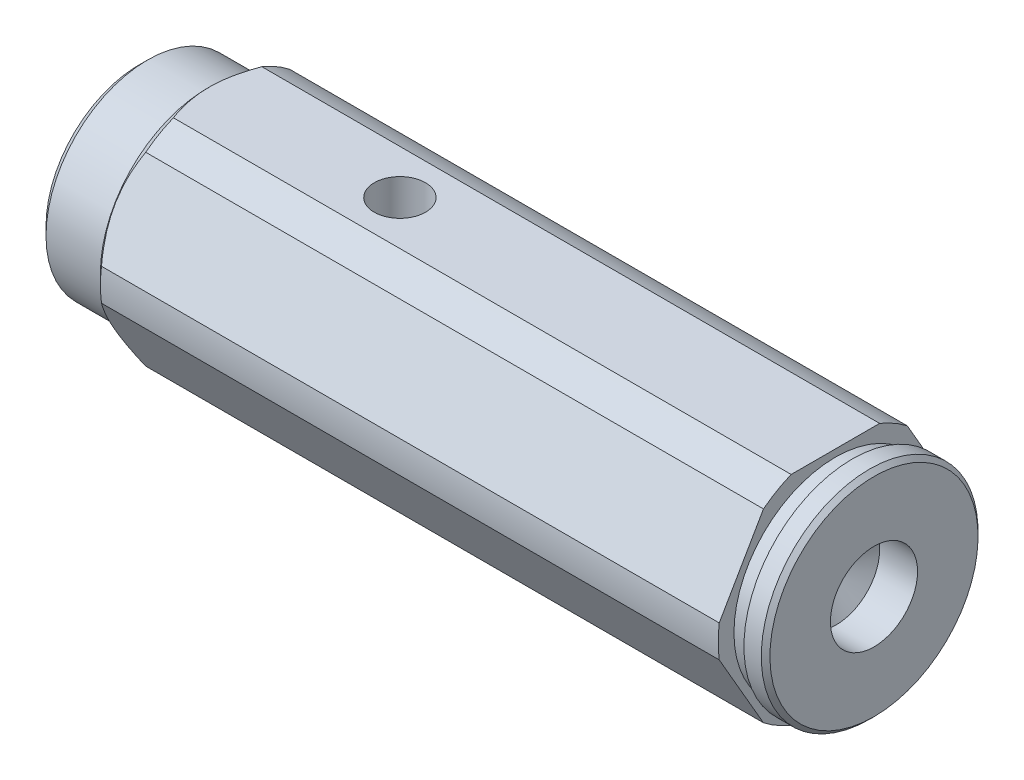
ISO-10303-21;
HEADER;
FILE_DESCRIPTION(('STEP AP214'),'2;1');
FILE_NAME('part.step','',(''),(''),'','','');
FILE_SCHEMA(('AUTOMOTIVE_DESIGN { 1 0 10303 214 1 1 1 1 }'));
ENDSEC;
DATA;
#1=APPLICATION_CONTEXT('core data for automotive mechanical design processes');
#2=APPLICATION_PROTOCOL_DEFINITION('international standard','automotive_design',2000,#1);
#3=PRODUCT_CONTEXT('',#1,'mechanical');
#4=PRODUCT('Part','Part','',(#3));
#5=PRODUCT_RELATED_PRODUCT_CATEGORY('part','',(#4));
#6=PRODUCT_DEFINITION_FORMATION('','',#4);
#7=PRODUCT_DEFINITION_CONTEXT('part definition',#1,'design');
#8=PRODUCT_DEFINITION('design','',#6,#7);
#9=PRODUCT_DEFINITION_SHAPE('','',#8);
#10=(LENGTH_UNIT() NAMED_UNIT(*) SI_UNIT(.MILLI.,.METRE.));
#11=(NAMED_UNIT(*) PLANE_ANGLE_UNIT() SI_UNIT($,.RADIAN.));
#12=(NAMED_UNIT(*) SI_UNIT($,.STERADIAN.) SOLID_ANGLE_UNIT());
#13=UNCERTAINTY_MEASURE_WITH_UNIT(LENGTH_MEASURE(1.E-05),#10,'distance_accuracy_value','');
#14=(GEOMETRIC_REPRESENTATION_CONTEXT(3) GLOBAL_UNCERTAINTY_ASSIGNED_CONTEXT((#13)) GLOBAL_UNIT_ASSIGNED_CONTEXT((#10,
#11,#12)) REPRESENTATION_CONTEXT('',''));
#15=CARTESIAN_POINT('',(0.,0.,0.));
#16=DIRECTION('',(0.,0.,1.));
#17=DIRECTION('',(1.,0.,0.));
#18=AXIS2_PLACEMENT_3D('',#15,#16,#17);
#19=CARTESIAN_POINT('',(9.84250000000097,-12.2936,0.));
#20=DIRECTION('',(-1.,0.,0.));
#21=DIRECTION('',(0.,-1.,0.));
#22=AXIS2_PLACEMENT_3D('',#19,#20,#21);
#23=PLANE('',#22);
#24=CARTESIAN_POINT('',(9.84250000000097,0.,0.));
#25=DIRECTION('',(1.,0.,0.));
#26=DIRECTION('',(0.,1.,0.));
#27=AXIS2_PLACEMENT_3D('',#24,#25,#26);
#28=CIRCLE('',#27,5.9436);
#29=CARTESIAN_POINT('',(9.84250000000097,5.9436,0.));
#30=VERTEX_POINT('',#29);
#31=EDGE_CURVE('E462',#30,#30,#28,.T.);
#32=ORIENTED_EDGE('',*,*,#31,.T.);
#33=EDGE_LOOP('',(#32));
#34=FACE_BOUND('',#33,.T.);
#35=CARTESIAN_POINT('',(9.84250000000096,0.,0.));
#36=DIRECTION('',(-1.,0.,0.));
#37=DIRECTION('',(0.,-1.,0.));
#38=AXIS2_PLACEMENT_3D('',#35,#36,#37);
#39=CIRCLE('',#38,6.35);
#40=CARTESIAN_POINT('',(9.84250000000097,-6.35,0.));
#41=VERTEX_POINT('',#40);
#42=EDGE_CURVE('E454',#41,#41,#39,.F.);
#43=ORIENTED_EDGE('',*,*,#42,.F.);
#44=EDGE_LOOP('',(#43));
#45=FACE_BOUND('',#44,.T.);
#46=ADVANCED_FACE('F40',(#34,#45),#23,.T.);
#47=CARTESIAN_POINT('',(27.94,0.,0.));
#48=DIRECTION('',(-1.,0.,0.));
#49=DIRECTION('',(0.,0.,1.));
#50=AXIS2_PLACEMENT_3D('',#47,#48,#49);
#51=CYLINDRICAL_SURFACE('',#50,6.87);
#52=DIRECTION('',(1.,0.,0.));
#53=VECTOR('',#52,1.);
#54=CARTESIAN_POINT('',(27.94,-6.3627,2.5909358753161));
#55=LINE('',#54,#53);
#56=CARTESIAN_POINT('',(-27.3399999999487,-6.3627,2.5909358753161));
#57=VERTEX_POINT('',#56);
#58=CARTESIAN_POINT('',(8.85190000000097,-6.3627,2.5909358753161));
#59=VERTEX_POINT('',#58);
#60=EDGE_CURVE('E102',#57,#59,#55,.T.);
#61=ORIENTED_EDGE('',*,*,#60,.T.);
#62=CARTESIAN_POINT('',(8.85190000000097,0.,0.));
#63=DIRECTION('',(1.,0.,0.));
#64=DIRECTION('',(0.,1.,0.));
#65=AXIS2_PLACEMENT_3D('',#62,#63,#64);
#66=CIRCLE('',#65,6.87);
#67=CARTESIAN_POINT('',(8.85190000000097,-5.42516628760019,4.21479189900122));
#68=VERTEX_POINT('',#67);
#69=EDGE_CURVE('E426',#59,#68,#66,.F.);
#70=ORIENTED_EDGE('',*,*,#69,.T.);
#71=DIRECTION('',(1.,0.,0.));
#72=VECTOR('',#71,1.);
#73=CARTESIAN_POINT('',(27.94,-5.42516628760019,4.21479189900122));
#74=LINE('',#73,#72);
#75=CARTESIAN_POINT('',(-27.3399999999487,-5.42516628752593,4.2147918990441));
#76=VERTEX_POINT('',#75);
#77=EDGE_CURVE('E209',#68,#76,#74,.F.);
#78=ORIENTED_EDGE('',*,*,#77,.T.);
#79=CARTESIAN_POINT('',(-27.339999999981,0.,0.));
#80=DIRECTION('',(1.,0.,0.));
#81=DIRECTION('',(0.,0.,1.));
#82=AXIS2_PLACEMENT_3D('',#79,#80,#81);
#83=CIRCLE('',#82,6.86999999993532);
#84=EDGE_CURVE('E212',#57,#76,#83,.F.);
#85=ORIENTED_EDGE('',*,*,#84,.F.);
#86=EDGE_LOOP('',(#61,#70,#78,#85));
#87=FACE_BOUND('',#86,.T.);
#88=ADVANCED_FACE('F281',(#87),#51,.T.);
#89=CARTESIAN_POINT('',(27.94,0.,7.34701311554568));
#90=DIRECTION('',(0.,0.5,-0.866025403784439));
#91=DIRECTION('',(0.,0.866025403784439,0.5));
#92=AXIS2_PLACEMENT_3D('',#89,#90,#91);
#93=PLANE('',#92);
#94=DIRECTION('',(0.,-0.866025403784439,-0.5));
#95=VECTOR('',#94,1.);
#96=CARTESIAN_POINT('',(8.85190000000097,0.,7.34701311554568));
#97=LINE('',#96,#95);
#98=CARTESIAN_POINT('',(8.85190000000097,-0.937533712399819,6.80572777431729));
#99=VERTEX_POINT('',#98);
#100=EDGE_CURVE('E429',#99,#68,#97,.T.);
#101=ORIENTED_EDGE('',*,*,#100,.F.);
#102=DIRECTION('',(1.,0.,0.));
#103=VECTOR('',#102,1.);
#104=CARTESIAN_POINT('',(27.94,-0.937533712399818,6.80572777431729));
#105=LINE('',#104,#103);
#106=CARTESIAN_POINT('',(-27.3399999999582,-0.937533712399819,6.80572777431729));
#107=VERTEX_POINT('',#106);
#108=EDGE_CURVE('E205',#107,#99,#105,.T.);
#109=ORIENTED_EDGE('',*,*,#108,.F.);
#110=CARTESIAN_POINT('',(-27.3399999999295,-5.42516628756962,4.21479189901865));
#111=CARTESIAN_POINT('',(-27.4177524265544,-5.24674178489839,4.31780533366605));
#112=CARTESIAN_POINT('',(-27.4885447931628,-5.06582668726134,4.42225671398733));
#113=CARTESIAN_POINT('',(-27.613400827378,-4.69923644543791,4.63390768878643));
#114=CARTESIAN_POINT('',(-27.6674204618428,-4.51355013472259,4.74111373026273));
#115=CARTESIAN_POINT('',(-27.753920348793,-4.14524333451015,4.95375576050974));
#116=CARTESIAN_POINT('',(-27.7870983610038,-3.96274870055006,5.05911908655226));
#117=CARTESIAN_POINT('',(-27.8327726491121,-3.59603778281758,5.27083973361989));
#118=CARTESIAN_POINT('',(-27.8452955763513,-3.41182402654936,5.37719559538977));
#119=CARTESIAN_POINT('',(-27.8489291778511,-3.03582263387905,5.59428010066365));
#120=CARTESIAN_POINT('',(-27.8391597405084,-2.84402793454131,5.70501282195544));
#121=CARTESIAN_POINT('',(-27.7970877773142,-2.46207754842718,5.92553198019551));
#122=CARTESIAN_POINT('',(-27.7647533343715,-2.27192456994404,6.03531685350996));
#123=CARTESIAN_POINT('',(-27.6781098340017,-1.8878776083856,6.25704647014719));
#124=CARTESIAN_POINT('',(-27.6230060406517,-1.69411957788003,6.36891272121723));
#125=CARTESIAN_POINT('',(-27.5265183598588,-1.40734551374411,6.53448180434271));
#126=CARTESIAN_POINT('',(-27.492099471478,-1.31250822958288,6.5892361358824));
#127=CARTESIAN_POINT('',(-27.4190813772406,-1.12408781290484,6.69802071417229));
#128=CARTESIAN_POINT('',(-27.3804838302452,-1.03050419916018,6.75205123875951));
#129=CARTESIAN_POINT('',(-27.3399999999273,-0.937533712424899,6.80572777430281));
#130=B_SPLINE_CURVE_WITH_KNOTS('',3,(#110,#111,#112,#113,#114,#115,#116,#117,#118,#119,#120,
#121,#122,#123,#124,#125,#126,#127,#128,#129),.UNSPECIFIED.,.F.,.F.,(4,2,2,2,2,2,2,2,2,4),(0.,
0.660858380522295,1.32343731080322,1.96245014707575,2.60063781557024,3.26445505033315,
3.92921313004727,4.61944983056105,4.96375213920367,5.30791826304414),.UNSPECIFIED.);
#131=EDGE_CURVE('E196',#76,#107,#130,.T.);
#132=ORIENTED_EDGE('',*,*,#131,.F.);
#133=ORIENTED_EDGE('',*,*,#77,.F.);
#134=EDGE_LOOP('',(#101,#109,#132,#133));
#135=FACE_BOUND('',#134,.T.);
#136=ADVANCED_FACE('F276',(#135),#93,.F.);
#137=CARTESIAN_POINT('',(27.94,-6.3627,3.67350655777285));
#138=DIRECTION('',(0.,1.,0.));
#139=DIRECTION('',(0.,0.,1.));
#140=AXIS2_PLACEMENT_3D('',#137,#138,#139);
#141=PLANE('',#140);
#142=CARTESIAN_POINT('',(-16.66238,-6.3627,0.));
#143=DIRECTION('',(0.,1.,0.));
#144=DIRECTION('',(0.,0.,1.));
#145=AXIS2_PLACEMENT_3D('',#142,#143,#144);
#146=CIRCLE('',#145,1.5);
#147=CARTESIAN_POINT('',(-16.66238,-6.3627,1.5));
#148=VERTEX_POINT('',#147);
#149=EDGE_CURVE('E302',#148,#148,#146,.T.);
#150=ORIENTED_EDGE('',*,*,#149,.T.);
#151=EDGE_LOOP('',(#150));
#152=FACE_BOUND('',#151,.T.);
#153=DIRECTION('',(0.,0.,-1.));
#154=VECTOR('',#153,1.);
#155=CARTESIAN_POINT('',(8.85190000000097,-6.3627,3.67350655777285));
#156=LINE('',#155,#154);
#157=CARTESIAN_POINT('',(8.85190000000097,-6.36270000000548,-2.59093587530264));
#158=VERTEX_POINT('',#157);
#159=EDGE_CURVE('E432',#59,#158,#156,.T.);
#160=ORIENTED_EDGE('',*,*,#159,.F.);
#161=ORIENTED_EDGE('',*,*,#60,.F.);
#162=CARTESIAN_POINT('',(-27.3399999999345,-6.36270000001469,-2.59093587528708));
#163=CARTESIAN_POINT('',(-27.4177524265554,-6.36270000000527,-2.38490900599071));
#164=CARTESIAN_POINT('',(-27.4885447931624,-6.36270000000141,-2.17600624534726));
#165=CARTESIAN_POINT('',(-27.6134008273768,-6.36269999999858,-1.75270429574781));
#166=CARTESIAN_POINT('',(-27.6674204618422,-6.36269999999963,-1.53829221279482));
#167=CARTESIAN_POINT('',(-27.753920348793,-6.36270000000036,-1.11300815229975));
#168=CARTESIAN_POINT('',(-27.7870983610039,-6.3627000000001,-0.902281500214052));
#169=CARTESIAN_POINT('',(-27.8327726491122,-6.3626999999999,-0.478840206077576));
#170=CARTESIAN_POINT('',(-27.8452955763514,-6.36269999999997,-0.266128482537216));
#171=CARTESIAN_POINT('',(-27.8489291778511,-6.36270000000003,0.168040528010437));
#172=CARTESIAN_POINT('',(-27.8391597405084,-6.36270000000001,0.389505970593345));
#173=CARTESIAN_POINT('',(-27.7970877773142,-6.36269999999999,0.830544287072172));
#174=CARTESIAN_POINT('',(-27.7647533343717,-6.3627,1.05011403370043));
#175=CARTESIAN_POINT('',(-27.6781098340022,-6.3627,1.49357326697346));
#176=CARTESIAN_POINT('',(-27.6230060406525,-6.3627,1.71730576911277));
#177=CARTESIAN_POINT('',(-27.5265183598601,-6.3627,2.04844393536258));
#178=CARTESIAN_POINT('',(-27.4920994714795,-6.3627,2.15795259844159));
#179=CARTESIAN_POINT('',(-27.4190813772425,-6.3627,2.37552175502061));
#180=CARTESIAN_POINT('',(-27.3804838302473,-6.3627,2.48358280419467));
#181=CARTESIAN_POINT('',(-27.3399999999296,-6.3627,2.59093587528091));
#182=B_SPLINE_CURVE_WITH_KNOTS('',3,(#162,#163,#164,#165,#166,#167,#168,#169,#170,#171,#172,
#173,#174,#175,#176,#177,#178,#179,#180,#181),.UNSPECIFIED.,.F.,.F.,(4,2,2,2,2,2,2,2,2,4),(0.,
0.660858380523664,1.32343731080623,1.96245014708063,2.60063781557688,3.26445505033778,
3.92921313004995,4.61944983056128,4.96375213920262,5.30791826304182),.UNSPECIFIED.);
#183=CARTESIAN_POINT('',(-27.3399999999641,-6.3627,-2.59093587530041));
#184=VERTEX_POINT('',#183);
#185=EDGE_CURVE('E215',#184,#57,#182,.T.);
#186=ORIENTED_EDGE('',*,*,#185,.F.);
#187=DIRECTION('',(-1.,0.,0.));
#188=VECTOR('',#187,1.);
#189=CARTESIAN_POINT('',(27.94,-6.3627,-2.5909358753161));
#190=LINE('',#189,#188);
#191=EDGE_CURVE('E195',#158,#184,#190,.T.);
#192=ORIENTED_EDGE('',*,*,#191,.F.);
#193=EDGE_LOOP('',(#160,#161,#186,#192));
#194=FACE_BOUND('',#193,.T.);
#195=ADVANCED_FACE('F280',(#152,#194),#141,.F.);
#196=CARTESIAN_POINT('',(27.94,0.,0.));
#197=DIRECTION('',(-1.,0.,0.));
#198=DIRECTION('',(0.,0.,1.));
#199=AXIS2_PLACEMENT_3D('',#196,#197,#198);
#200=CYLINDRICAL_SURFACE('',#199,6.87);
#201=ORIENTED_EDGE('',*,*,#108,.T.);
#202=CARTESIAN_POINT('',(8.85190000000097,0.,0.));
#203=DIRECTION('',(1.,0.,0.));
#204=DIRECTION('',(0.,1.,0.));
#205=AXIS2_PLACEMENT_3D('',#202,#203,#204);
#206=CIRCLE('',#205,6.87);
#207=CARTESIAN_POINT('',(8.85190000000096,0.937533712399824,6.80572777431729));
#208=VERTEX_POINT('',#207);
#209=EDGE_CURVE('E431',#99,#208,#206,.F.);
#210=ORIENTED_EDGE('',*,*,#209,.T.);
#211=DIRECTION('',(1.,0.,0.));
#212=VECTOR('',#211,1.);
#213=CARTESIAN_POINT('',(27.94,0.937533712399821,6.80572777431729));
#214=LINE('',#213,#212);
#215=CARTESIAN_POINT('',(-27.3399999999582,0.937533712399824,6.80572777431729));
#216=VERTEX_POINT('',#215);
#217=EDGE_CURVE('E190',#208,#216,#214,.F.);
#218=ORIENTED_EDGE('',*,*,#217,.T.);
#219=CARTESIAN_POINT('',(-27.34,0.,0.));
#220=DIRECTION('',(-1.,0.,0.));
#221=DIRECTION('',(0.,0.,1.));
#222=AXIS2_PLACEMENT_3D('',#219,#220,#221);
#223=CIRCLE('',#222,6.87);
#224=EDGE_CURVE('E197',#216,#107,#223,.F.);
#225=ORIENTED_EDGE('',*,*,#224,.T.);
#226=EDGE_LOOP('',(#201,#210,#218,#225));
#227=FACE_BOUND('',#226,.T.);
#228=ADVANCED_FACE('F312',(#227),#200,.T.);
#229=CARTESIAN_POINT('',(27.94,0.,0.));
#230=DIRECTION('',(-1.,0.,0.));
#231=DIRECTION('',(0.,0.,1.));
#232=AXIS2_PLACEMENT_3D('',#229,#230,#231);
#233=CYLINDRICAL_SURFACE('',#232,6.87);
#234=DIRECTION('',(1.,0.,0.));
#235=VECTOR('',#234,1.);
#236=CARTESIAN_POINT('',(27.94,-5.42516628760024,-4.21479189900117));
#237=LINE('',#236,#235);
#238=CARTESIAN_POINT('',(-27.3399999999582,-5.42516628760024,-4.21479189900117));
#239=VERTEX_POINT('',#238);
#240=CARTESIAN_POINT('',(8.85190000000097,-5.42516628760024,-4.21479189900117));
#241=VERTEX_POINT('',#240);
#242=EDGE_CURVE('E174',#239,#241,#237,.T.);
#243=ORIENTED_EDGE('',*,*,#242,.T.);
#244=CARTESIAN_POINT('',(8.85190000000097,0.,0.));
#245=DIRECTION('',(1.,0.,0.));
#246=DIRECTION('',(0.,1.,0.));
#247=AXIS2_PLACEMENT_3D('',#244,#245,#246);
#248=CIRCLE('',#247,6.87);
#249=EDGE_CURVE('E420',#241,#158,#248,.F.);
#250=ORIENTED_EDGE('',*,*,#249,.T.);
#251=ORIENTED_EDGE('',*,*,#191,.T.);
#252=CARTESIAN_POINT('',(-27.34,0.,0.));
#253=DIRECTION('',(-1.,0.,0.));
#254=DIRECTION('',(0.,0.,1.));
#255=AXIS2_PLACEMENT_3D('',#252,#253,#254);
#256=CIRCLE('',#255,6.87);
#257=EDGE_CURVE('E193',#184,#239,#256,.F.);
#258=ORIENTED_EDGE('',*,*,#257,.T.);
#259=EDGE_LOOP('',(#243,#250,#251,#258));
#260=FACE_BOUND('',#259,.T.);
#261=ADVANCED_FACE('F310',(#260),#233,.T.);
#262=CARTESIAN_POINT('',(27.94,6.3627,3.67350655777285));
#263=DIRECTION('',(0.,-0.5,-0.866025403784439));
#264=DIRECTION('',(0.,0.866025403784439,-0.5));
#265=AXIS2_PLACEMENT_3D('',#262,#263,#264);
#266=PLANE('',#265);
#267=DIRECTION('',(0.,-0.866025403784439,0.5));
#268=VECTOR('',#267,1.);
#269=CARTESIAN_POINT('',(8.85190000000096,6.3627,3.67350655777285));
#270=LINE('',#269,#268);
#271=CARTESIAN_POINT('',(8.85190000000097,5.42516628757105,4.21479189903873));
#272=VERTEX_POINT('',#271);
#273=EDGE_CURVE('E401',#272,#208,#270,.T.);
#274=ORIENTED_EDGE('',*,*,#273,.F.);
#275=DIRECTION('',(-1.,0.,0.));
#276=VECTOR('',#275,1.);
#277=CARTESIAN_POINT('',(27.94,5.42516628760019,4.21479189900123));
#278=LINE('',#277,#276);
#279=CARTESIAN_POINT('',(-27.339999999955,5.42516628758564,4.21479189900963));
#280=VERTEX_POINT('',#279);
#281=EDGE_CURVE('E187',#280,#272,#278,.F.);
#282=ORIENTED_EDGE('',*,*,#281,.F.);
#283=CARTESIAN_POINT('',(-27.3399999999345,0.937533712432305,6.80572777431551));
#284=CARTESIAN_POINT('',(-27.4177524265554,1.11595821510043,6.70271433965917));
#285=CARTESIAN_POINT('',(-27.4885447931624,1.29687331273642,6.5982629593341));
#286=CARTESIAN_POINT('',(-27.6134008273768,1.66346355455962,6.38661198453192));
#287=CARTESIAN_POINT('',(-27.6674204618422,1.84914986527576,6.27940594305633));
#288=CARTESIAN_POINT('',(-27.753920348793,2.21745666548945,6.06676391280943));
#289=CARTESIAN_POINT('',(-27.7870983610039,2.39995129944998,5.96140058676635));
#290=CARTESIAN_POINT('',(-27.8327726491122,2.76666221718343,5.74967993969795));
#291=CARTESIAN_POINT('',(-27.8452955763513,2.95087597345219,5.64332407792783));
#292=CARTESIAN_POINT('',(-27.8489291778511,3.32687736612252,5.426239572654));
#293=CARTESIAN_POINT('',(-27.8391597405083,3.51867206545977,5.31550685136248));
#294=CARTESIAN_POINT('',(-27.7970877773142,3.90062245157292,5.09498769312295));
#295=CARTESIAN_POINT('',(-27.7647533343716,4.09077543005559,4.98520281980877));
#296=CARTESIAN_POINT('',(-27.678109834002,4.47482239161299,4.76347320317216));
#297=CARTESIAN_POINT('',(-27.6230060406523,4.66858042211798,4.65160695210245));
#298=CARTESIAN_POINT('',(-27.5265183598598,4.95535448625305,4.48603786897746));
#299=CARTESIAN_POINT('',(-27.4920994714792,5.05019177041398,4.43128353743793));
#300=CARTESIAN_POINT('',(-27.4190813772421,5.23861218709145,4.32249895914838));
#301=CARTESIAN_POINT('',(-27.3804838302468,5.33219580083583,4.26846843456132));
#302=CARTESIAN_POINT('',(-27.3399999999292,5.42516628757083,4.21479189901818));
#303=B_SPLINE_CURVE_WITH_KNOTS('',3,(#283,#284,#285,#286,#287,#288,#289,#290,#291,#292,#293,
#294,#295,#296,#297,#298,#299,#300,#301,#302),.UNSPECIFIED.,.F.,.F.,(4,2,2,2,2,2,2,2,2,4),(0.,
0.660858380523661,1.32343731080623,1.96245014708062,2.60063781557687,3.26445505033807,
3.92921313005056,4.61944983056224,4.96375213920375,5.30791826304312),.UNSPECIFIED.);
#304=EDGE_CURVE('E186',#216,#280,#303,.T.);
#305=ORIENTED_EDGE('',*,*,#304,.F.);
#306=ORIENTED_EDGE('',*,*,#217,.F.);
#307=EDGE_LOOP('',(#274,#282,#305,#306));
#308=FACE_BOUND('',#307,.T.);
#309=ADVANCED_FACE('F400',(#308),#266,.F.);
#310=CARTESIAN_POINT('',(27.94,0.,0.));
#311=DIRECTION('',(-1.,0.,0.));
#312=DIRECTION('',(0.,0.,1.));
#313=AXIS2_PLACEMENT_3D('',#310,#311,#312);
#314=CYLINDRICAL_SURFACE('',#313,6.87);
#315=ORIENTED_EDGE('',*,*,#281,.T.);
#316=CARTESIAN_POINT('',(8.85190000000097,0.,0.));
#317=DIRECTION('',(1.,0.,0.));
#318=DIRECTION('',(0.,1.,0.));
#319=AXIS2_PLACEMENT_3D('',#316,#317,#318);
#320=CIRCLE('',#319,6.87);
#321=CARTESIAN_POINT('',(8.85190000000096,6.3627,2.5909358753161));
#322=VERTEX_POINT('',#321);
#323=EDGE_CURVE('E406',#272,#322,#320,.F.);
#324=ORIENTED_EDGE('',*,*,#323,.T.);
#325=DIRECTION('',(1.,0.,0.));
#326=VECTOR('',#325,1.);
#327=CARTESIAN_POINT('',(27.94,6.3627,2.5909358753161));
#328=LINE('',#327,#326);
#329=CARTESIAN_POINT('',(-27.3399999999487,6.3627,2.59093587523034));
#330=VERTEX_POINT('',#329);
#331=EDGE_CURVE('E180',#322,#330,#328,.F.);
#332=ORIENTED_EDGE('',*,*,#331,.T.);
#333=CARTESIAN_POINT('',(-27.339999999981,0.,0.));
#334=DIRECTION('',(1.,0.,0.));
#335=DIRECTION('',(0.,0.,1.));
#336=AXIS2_PLACEMENT_3D('',#333,#334,#335);
#337=CIRCLE('',#336,6.86999999993532);
#338=EDGE_CURVE('E183',#280,#330,#337,.F.);
#339=ORIENTED_EDGE('',*,*,#338,.F.);
#340=EDGE_LOOP('',(#315,#324,#332,#339));
#341=FACE_BOUND('',#340,.T.);
#342=ADVANCED_FACE('F404',(#341),#314,.T.);
#343=CARTESIAN_POINT('',(27.94,6.3627,-3.67350655777281));
#344=DIRECTION('',(0.,-1.,0.));
#345=DIRECTION('',(0.,0.,-1.));
#346=AXIS2_PLACEMENT_3D('',#343,#344,#345);
#347=PLANE('',#346);
#348=CARTESIAN_POINT('',(-16.66238,6.3627,0.));
#349=DIRECTION('',(0.,1.,0.));
#350=DIRECTION('',(0.,0.,1.));
#351=AXIS2_PLACEMENT_3D('',#348,#349,#350);
#352=CIRCLE('',#351,1.5);
#353=CARTESIAN_POINT('',(-16.66238,6.3627,1.5));
#354=VERTEX_POINT('',#353);
#355=EDGE_CURVE('E182',#354,#354,#352,.T.);
#356=ORIENTED_EDGE('',*,*,#355,.F.);
#357=EDGE_LOOP('',(#356));
#358=FACE_BOUND('',#357,.T.);
#359=DIRECTION('',(0.,0.,1.));
#360=VECTOR('',#359,1.);
#361=CARTESIAN_POINT('',(8.85190000000096,6.3627,-3.67350655777281));
#362=LINE('',#361,#360);
#363=CARTESIAN_POINT('',(8.85190000000097,6.36270000000293,-2.59093587530889));
#364=VERTEX_POINT('',#363);
#365=EDGE_CURVE('E409',#364,#322,#362,.T.);
#366=ORIENTED_EDGE('',*,*,#365,.F.);
#367=DIRECTION('',(-1.,0.,0.));
#368=VECTOR('',#367,1.);
#369=CARTESIAN_POINT('',(27.94,6.3627,-2.5909358753161));
#370=LINE('',#369,#368);
#371=CARTESIAN_POINT('',(-27.339999999955,6.3627,-2.5909358752993));
#372=VERTEX_POINT('',#371);
#373=EDGE_CURVE('E154',#372,#364,#370,.F.);
#374=ORIENTED_EDGE('',*,*,#373,.F.);
#375=CARTESIAN_POINT('',(-27.3399999999295,6.3626999999998,2.59093587528091));
#376=CARTESIAN_POINT('',(-27.4177524265544,6.36269999999993,2.38490900598632));
#377=CARTESIAN_POINT('',(-27.4885447931628,6.36269999999998,2.17600624534385));
#378=CARTESIAN_POINT('',(-27.613400827378,6.36270000000002,1.75270429574574));
#379=CARTESIAN_POINT('',(-27.6674204618428,6.3627,1.53829221279311));
#380=CARTESIAN_POINT('',(-27.753920348793,6.36269999999999,1.11300815229907));
#381=CARTESIAN_POINT('',(-27.7870983610038,6.3627,0.902281500214028));
#382=CARTESIAN_POINT('',(-27.8327726491121,6.3627,0.47884020607878));
#383=CARTESIAN_POINT('',(-27.8452955763513,6.3627,0.266128482538995));
#384=CARTESIAN_POINT('',(-27.8489291778511,6.3627,-0.168040528008339));
#385=CARTESIAN_POINT('',(-27.8391597405085,6.3627,-0.389505970591504));
#386=CARTESIAN_POINT('',(-27.7970877773144,6.3627,-0.830544287070825));
#387=CARTESIAN_POINT('',(-27.7647533343719,6.3627,-1.05011403369932));
#388=CARTESIAN_POINT('',(-27.6781098340023,6.3627,-1.49357326697294));
#389=CARTESIAN_POINT('',(-27.6230060406526,6.3627,-1.71730576911261));
#390=CARTESIAN_POINT('',(-27.52651835986,6.3627,-2.04844393536295));
#391=CARTESIAN_POINT('',(-27.4920994714793,6.3627,-2.15795259844215));
#392=CARTESIAN_POINT('',(-27.4190813772422,6.3627,-2.37552175502153));
#393=CARTESIAN_POINT('',(-27.3804838302469,6.3627,-2.48358280419577));
#394=CARTESIAN_POINT('',(-27.3399999999292,6.3627,-2.59093587528219));
#395=B_SPLINE_CURVE_WITH_KNOTS('',3,(#375,#376,#377,#378,#379,#380,#381,#382,#383,#384,#385,
#386,#387,#388,#389,#390,#391,#392,#393,#394),.UNSPECIFIED.,.F.,.F.,(4,2,2,2,2,2,2,2,2,4),(0.,
0.66085838052229,1.3234373108032,1.96245014707575,2.60063781557025,3.26445505033191,
3.92921313004478,4.61944983055719,4.96375213919913,5.30791826303892),.UNSPECIFIED.);
#396=EDGE_CURVE('E173',#330,#372,#395,.T.);
#397=ORIENTED_EDGE('',*,*,#396,.F.);
#398=ORIENTED_EDGE('',*,*,#331,.F.);
#399=EDGE_LOOP('',(#366,#374,#397,#398));
#400=FACE_BOUND('',#399,.T.);
#401=ADVANCED_FACE('F408',(#358,#400),#347,.F.);
#402=CARTESIAN_POINT('',(27.94,-6.3627,-3.67350655777282));
#403=DIRECTION('',(0.,0.5,0.866025403784439));
#404=DIRECTION('',(0.,-0.866025403784439,0.5));
#405=AXIS2_PLACEMENT_3D('',#402,#403,#404);
#406=PLANE('',#405);
#407=DIRECTION('',(0.,0.866025403784439,-0.5));
#408=VECTOR('',#407,1.);
#409=CARTESIAN_POINT('',(8.85190000000097,-6.3627,-3.67350655777281));
#410=LINE('',#409,#408);
#411=CARTESIAN_POINT('',(8.85190000000097,-0.937533712478428,-6.80572777430646));
#412=VERTEX_POINT('',#411);
#413=EDGE_CURVE('E155',#241,#412,#410,.T.);
#414=ORIENTED_EDGE('',*,*,#413,.F.);
#415=ORIENTED_EDGE('',*,*,#242,.F.);
#416=CARTESIAN_POINT('',(-27.3399999999293,-0.937533712427818,-6.80572777430393));
#417=CARTESIAN_POINT('',(-27.4177524265535,-1.11595821509869,-6.70271433965506));
#418=CARTESIAN_POINT('',(-27.4885447931618,-1.29687331273569,-6.59826295933313));
#419=CARTESIAN_POINT('',(-27.6134008273771,-1.66346355455931,-6.38661198453342));
#420=CARTESIAN_POINT('',(-27.6674204618421,-1.84914986527487,-6.27940594305717));
#421=CARTESIAN_POINT('',(-27.7539203487926,-2.21745666548773,-6.06676391281005));
#422=CARTESIAN_POINT('',(-27.7870983610035,-2.399951299448,-5.96140058676737));
#423=CARTESIAN_POINT('',(-27.832772649112,-2.76666221718085,-5.7496799396995));
#424=CARTESIAN_POINT('',(-27.8452955763512,-2.95087597344927,-5.64332407792951));
#425=CARTESIAN_POINT('',(-27.8489291778512,-3.32687736612019,-5.42623957265529));
#426=CARTESIAN_POINT('',(-27.8391597405085,-3.51867206545835,-5.31550685136325));
#427=CARTESIAN_POINT('',(-27.7970877773142,-3.9006224515733,-5.0949876931227));
#428=CARTESIAN_POINT('',(-27.7647533343714,-4.09077543005686,-4.98520281980801));
#429=CARTESIAN_POINT('',(-27.6781098340013,-4.47482239161614,-4.76347320317031));
#430=CARTESIAN_POINT('',(-27.6230060406511,-4.66858042212212,-4.65160695210002));
#431=CARTESIAN_POINT('',(-27.5265183598578,-4.95535448625865,-4.4860378689742));
#432=CARTESIAN_POINT('',(-27.4920994714769,-5.05019177042007,-4.43128353743439));
#433=CARTESIAN_POINT('',(-27.4190813772393,-5.23861218709849,-4.32249895914428));
#434=CARTESIAN_POINT('',(-27.3804838302437,-5.33219580084334,-4.26846843455695));
#435=CARTESIAN_POINT('',(-27.3399999999257,-5.42516628757881,-4.21479189901354));
#436=B_SPLINE_CURVE_WITH_KNOTS('',3,(#416,#417,#418,#419,#420,#421,#422,#423,#424,#425,#426,
#427,#428,#429,#430,#431,#432,#433,#434,#435),.UNSPECIFIED.,.F.,.F.,(4,2,2,2,2,2,2,2,2,4),(0.,
0.660858380522966,1.32343731080461,1.96245014707786,2.60063781557303,3.26445505033737,
3.92921313005295,4.61944983056826,4.96375213921163,5.30791826305285),.UNSPECIFIED.);
#437=CARTESIAN_POINT('',(-27.339999999981,-0.937533712474015,-6.80572777427443));
#438=VERTEX_POINT('',#437);
#439=EDGE_CURVE('E176',#438,#239,#436,.T.);
#440=ORIENTED_EDGE('',*,*,#439,.F.);
#441=DIRECTION('',(-1.,0.,0.));
#442=VECTOR('',#441,1.);
#443=CARTESIAN_POINT('',(27.94,-0.937533712399748,-6.8057277743173));
#444=LINE('',#443,#442);
#445=EDGE_CURVE('E161',#412,#438,#444,.T.);
#446=ORIENTED_EDGE('',*,*,#445,.F.);
#447=EDGE_LOOP('',(#414,#415,#440,#446));
#448=FACE_BOUND('',#447,.T.);
#449=ADVANCED_FACE('F417',(#448),#406,.F.);
#450=CARTESIAN_POINT('',(27.94,0.,0.));
#451=DIRECTION('',(-1.,0.,0.));
#452=DIRECTION('',(0.,0.,1.));
#453=AXIS2_PLACEMENT_3D('',#450,#451,#452);
#454=CYLINDRICAL_SURFACE('',#453,6.87);
#455=ORIENTED_EDGE('',*,*,#373,.T.);
#456=CARTESIAN_POINT('',(8.85190000000097,0.,0.));
#457=DIRECTION('',(1.,0.,0.));
#458=DIRECTION('',(0.,1.,0.));
#459=AXIS2_PLACEMENT_3D('',#456,#457,#458);
#460=CIRCLE('',#459,6.87);
#461=CARTESIAN_POINT('',(8.85190000000097,5.42516628760024,-4.21479189900116));
#462=VERTEX_POINT('',#461);
#463=EDGE_CURVE('E141',#364,#462,#460,.F.);
#464=ORIENTED_EDGE('',*,*,#463,.T.);
#465=DIRECTION('',(1.,0.,0.));
#466=VECTOR('',#465,1.);
#467=CARTESIAN_POINT('',(27.94,5.42516628760024,-4.21479189900116));
#468=LINE('',#467,#466);
#469=CARTESIAN_POINT('',(-27.339999999981,5.42516628752597,-4.21479189904404));
#470=VERTEX_POINT('',#469);
#471=EDGE_CURVE('E151',#462,#470,#468,.F.);
#472=ORIENTED_EDGE('',*,*,#471,.T.);
#473=CARTESIAN_POINT('',(-27.339999999981,0.,0.));
#474=DIRECTION('',(1.,0.,0.));
#475=DIRECTION('',(0.,0.,1.));
#476=AXIS2_PLACEMENT_3D('',#473,#474,#475);
#477=CIRCLE('',#476,6.86999999993532);
#478=EDGE_CURVE('E169',#372,#470,#477,.F.);
#479=ORIENTED_EDGE('',*,*,#478,.F.);
#480=EDGE_LOOP('',(#455,#464,#472,#479));
#481=FACE_BOUND('',#480,.T.);
#482=ADVANCED_FACE('F149',(#481),#454,.T.);
#483=CARTESIAN_POINT('',(27.94,0.,0.));
#484=DIRECTION('',(-1.,0.,0.));
#485=DIRECTION('',(0.,0.,1.));
#486=AXIS2_PLACEMENT_3D('',#483,#484,#485);
#487=CYLINDRICAL_SURFACE('',#486,6.87);
#488=DIRECTION('',(1.,0.,0.));
#489=VECTOR('',#488,1.);
#490=CARTESIAN_POINT('',(27.94,0.937533712399749,-6.8057277743173));
#491=LINE('',#490,#489);
#492=CARTESIAN_POINT('',(-27.3399999999582,0.937533712399751,-6.8057277743173));
#493=VERTEX_POINT('',#492);
#494=CARTESIAN_POINT('',(8.85190000000096,0.937533712399749,-6.8057277743173));
#495=VERTEX_POINT('',#494);
#496=EDGE_CURVE('E145',#493,#495,#491,.T.);
#497=ORIENTED_EDGE('',*,*,#496,.T.);
#498=CARTESIAN_POINT('',(8.85190000000097,0.,0.));
#499=DIRECTION('',(1.,0.,0.));
#500=DIRECTION('',(0.,1.,0.));
#501=AXIS2_PLACEMENT_3D('',#498,#499,#500);
#502=CIRCLE('',#501,6.87);
#503=EDGE_CURVE('E55',#495,#412,#502,.F.);
#504=ORIENTED_EDGE('',*,*,#503,.T.);
#505=ORIENTED_EDGE('',*,*,#445,.T.);
#506=CARTESIAN_POINT('',(-27.34,0.,0.));
#507=DIRECTION('',(-1.,0.,0.));
#508=DIRECTION('',(0.,0.,1.));
#509=AXIS2_PLACEMENT_3D('',#506,#507,#508);
#510=CIRCLE('',#509,6.87);
#511=EDGE_CURVE('E64',#438,#493,#510,.F.);
#512=ORIENTED_EDGE('',*,*,#511,.T.);
#513=EDGE_LOOP('',(#497,#504,#505,#512));
#514=FACE_BOUND('',#513,.T.);
#515=ADVANCED_FACE('F246',(#514),#487,.T.);
#516=CARTESIAN_POINT('',(27.94,0.,-7.34701311554565));
#517=DIRECTION('',(0.,-0.5,0.866025403784439));
#518=DIRECTION('',(0.,-0.866025403784439,-0.5));
#519=AXIS2_PLACEMENT_3D('',#516,#517,#518);
#520=PLANE('',#519);
#521=DIRECTION('',(0.,0.866025403784439,0.5));
#522=VECTOR('',#521,1.);
#523=CARTESIAN_POINT('',(8.85190000000097,0.,-7.34701311554565));
#524=LINE('',#523,#522);
#525=EDGE_CURVE('E137',#495,#462,#524,.T.);
#526=ORIENTED_EDGE('',*,*,#525,.F.);
#527=ORIENTED_EDGE('',*,*,#496,.F.);
#528=CARTESIAN_POINT('',(-27.3399999999293,5.42516628757462,-4.21479189901879));
#529=CARTESIAN_POINT('',(-27.4177524265535,5.24674178490218,-4.31780533366493));
#530=CARTESIAN_POINT('',(-27.4885447931618,5.06582668726453,-4.42225671398575));
#531=CARTESIAN_POINT('',(-27.6134008273771,4.69923644544044,-4.63390768878463));
#532=CARTESIAN_POINT('',(-27.6674204618421,4.51355013472505,-4.74111373026119));
#533=CARTESIAN_POINT('',(-27.7539203487926,4.14524333451232,-4.95375576050853));
#534=CARTESIAN_POINT('',(-27.7870983610036,3.962748700552,-5.05911908655113));
#535=CARTESIAN_POINT('',(-27.832772649112,3.59603778281912,-5.27083973361895));
#536=CARTESIAN_POINT('',(-27.8452955763512,3.41182402655071,-5.37719559538896));
#537=CARTESIAN_POINT('',(-27.8489291778512,3.0358226338798,-5.59428010066319));
#538=CARTESIAN_POINT('',(-27.8391597405085,2.84402793454164,-5.70501282195522));
#539=CARTESIAN_POINT('',(-27.7970877773142,2.46207754842668,-5.92553198019577));
#540=CARTESIAN_POINT('',(-27.7647533343714,2.27192456994313,-6.03531685351046));
#541=CARTESIAN_POINT('',(-27.6781098340013,1.88787760838385,-6.25704647014816));
#542=CARTESIAN_POINT('',(-27.6230060406511,1.69411957787787,-6.36891272121844));
#543=CARTESIAN_POINT('',(-27.5265183598578,1.40734551374135,-6.53448180434427));
#544=CARTESIAN_POINT('',(-27.4920994714769,1.31250822957992,-6.58923613588408));
#545=CARTESIAN_POINT('',(-27.4190813772393,1.1240878129015,-6.69802071417419));
#546=CARTESIAN_POINT('',(-27.3804838302437,1.03050419915665,-6.75205123876151));
#547=CARTESIAN_POINT('',(-27.3399999999257,0.937533712421188,-6.80572777430493));
#548=B_SPLINE_CURVE_WITH_KNOTS('',3,(#528,#529,#530,#531,#532,#533,#534,#535,#536,#537,#538,
#539,#540,#541,#542,#543,#544,#545,#546,#547),.UNSPECIFIED.,.F.,.F.,(4,2,2,2,2,2,2,2,2,4),(0.,
0.660858380522967,1.32343731080461,1.96245014707786,2.60063781557304,3.26445505033737,
3.92921313005295,4.61944983056826,4.96375213921163,5.30791826305284),.UNSPECIFIED.);
#549=EDGE_CURVE('E160',#470,#493,#548,.T.);
#550=ORIENTED_EDGE('',*,*,#549,.F.);
#551=ORIENTED_EDGE('',*,*,#471,.F.);
#552=EDGE_LOOP('',(#526,#527,#550,#551));
#553=FACE_BOUND('',#552,.T.);
#554=ADVANCED_FACE('F158',(#553),#520,.F.);
#555=CARTESIAN_POINT('',(-31.9400000000769,0.,0.));
#556=DIRECTION('',(-1.,0.,0.));
#557=DIRECTION('',(0.,0.,1.));
#558=AXIS2_PLACEMENT_3D('',#555,#556,#557);
#559=CONICAL_SURFACE('',#558,4.0000000000191,0.785398163511135);
#560=CARTESIAN_POINT('',(-31.9399999999632,0.,0.));
#561=DIRECTION('',(-1.,0.,0.));
#562=DIRECTION('',(0.,0.,1.));
#563=AXIS2_PLACEMENT_3D('',#560,#561,#562);
#564=CIRCLE('',#563,3.99999999990541);
#565=CARTESIAN_POINT('',(-31.9399999999632,0.,3.99999999990541));
#566=VERTEX_POINT('',#565);
#567=EDGE_CURVE('E225',#566,#566,#564,.F.);
#568=ORIENTED_EDGE('',*,*,#567,.F.);
#569=EDGE_LOOP('',(#568));
#570=FACE_BOUND('',#569,.T.);
#571=CARTESIAN_POINT('',(-31.69,0.,0.));
#572=DIRECTION('',(-1.,0.,0.));
#573=DIRECTION('',(0.,0.,1.));
#574=AXIS2_PLACEMENT_3D('',#571,#572,#573);
#575=CIRCLE('',#574,3.75);
#576=CARTESIAN_POINT('',(-31.69,0.,3.75));
#577=VERTEX_POINT('',#576);
#578=EDGE_CURVE('E223',#577,#577,#575,.F.);
#579=ORIENTED_EDGE('',*,*,#578,.T.);
#580=EDGE_LOOP('',(#579));
#581=FACE_BOUND('',#580,.T.);
#582=ADVANCED_FACE('F344',(#570,#581),#559,.F.);
#583=CARTESIAN_POINT('',(-31.94,0.,0.));
#584=DIRECTION('',(-1.,0.,0.));
#585=DIRECTION('',(0.,0.,1.));
#586=AXIS2_PLACEMENT_3D('',#583,#584,#585);
#587=PLANE('',#586);
#588=ORIENTED_EDGE('',*,*,#567,.T.);
#589=EDGE_LOOP('',(#588));
#590=FACE_BOUND('',#589,.T.);
#591=CARTESIAN_POINT('',(-31.9400000000201,0.,0.));
#592=DIRECTION('',(1.,0.,0.));
#593=DIRECTION('',(0.,0.,-1.));
#594=AXIS2_PLACEMENT_3D('',#591,#592,#593);
#595=CIRCLE('',#594,5.45499999998356);
#596=CARTESIAN_POINT('',(-31.9400000000201,0.,-5.45499999998356));
#597=VERTEX_POINT('',#596);
#598=EDGE_CURVE('E222',#597,#597,#595,.T.);
#599=ORIENTED_EDGE('',*,*,#598,.F.);
#600=EDGE_LOOP('',(#599));
#601=FACE_BOUND('',#600,.T.);
#602=ADVANCED_FACE('F350',(#590,#601),#587,.T.);
#603=CARTESIAN_POINT('',(-31.94,0.,0.));
#604=DIRECTION('',(-1.,0.,0.));
#605=DIRECTION('',(0.,0.,1.));
#606=AXIS2_PLACEMENT_3D('',#603,#604,#605);
#607=CYLINDRICAL_SURFACE('',#606,3.75);
#608=ORIENTED_EDGE('',*,*,#578,.F.);
#609=EDGE_LOOP('',(#608));
#610=FACE_BOUND('',#609,.T.);
#611=CARTESIAN_POINT('',(-19.9400000000196,0.,0.));
#612=DIRECTION('',(-1.,0.,0.));
#613=DIRECTION('',(0.,0.,1.));
#614=AXIS2_PLACEMENT_3D('',#611,#612,#613);
#615=CIRCLE('',#614,3.75000000002501);
#616=CARTESIAN_POINT('',(-19.9400000000196,0.,3.75000000002501));
#617=VERTEX_POINT('',#616);
#618=EDGE_CURVE('E211',#617,#617,#615,.F.);
#619=ORIENTED_EDGE('',*,*,#618,.T.);
#620=EDGE_LOOP('',(#619));
#621=FACE_BOUND('',#620,.T.);
#622=ADVANCED_FACE('F356',(#610,#621),#607,.F.);
#623=CARTESIAN_POINT('',(-31.439999999975,0.,0.));
#624=DIRECTION('',(1.,0.,0.));
#625=DIRECTION('',(0.,0.,-1.));
#626=AXIS2_PLACEMENT_3D('',#623,#624,#625);
#627=CONICAL_SURFACE('',#626,5.95499999997173,0.785398163340605);
#628=ORIENTED_EDGE('',*,*,#598,.T.);
#629=EDGE_LOOP('',(#628));
#630=FACE_BOUND('',#629,.T.);
#631=CARTESIAN_POINT('',(-31.44,0.,0.));
#632=DIRECTION('',(1.,0.,0.));
#633=DIRECTION('',(0.,0.,-1.));
#634=AXIS2_PLACEMENT_3D('',#631,#632,#633);
#635=CIRCLE('',#634,5.955);
#636=CARTESIAN_POINT('',(-31.44,0.,-5.955));
#637=VERTEX_POINT('',#636);
#638=EDGE_CURVE('E200',#637,#637,#635,.T.);
#639=ORIENTED_EDGE('',*,*,#638,.F.);
#640=EDGE_LOOP('',(#639));
#641=FACE_BOUND('',#640,.T.);
#642=ADVANCED_FACE('F293',(#630,#641),#627,.T.);
#643=CARTESIAN_POINT('',(-19.9399999999628,0.,0.));
#644=DIRECTION('',(-1.,0.,0.));
#645=DIRECTION('',(0.,0.,1.));
#646=AXIS2_PLACEMENT_3D('',#643,#644,#645);
#647=CONICAL_SURFACE('',#646,3.74999999991132,1.02974425867044);
#648=ORIENTED_EDGE('',*,*,#618,.F.);
#649=EDGE_LOOP('',(#648));
#650=FACE_BOUND('',#649,.T.);
#651=CARTESIAN_POINT('',(-18.0413934377675,0.,0.590188053451217));
#652=CARTESIAN_POINT('',(-18.0413967663831,-0.0522544496009095,0.590186297408778));
#653=CARTESIAN_POINT('',(-18.0431539508622,-0.1045401252372,0.586125876331229));
#654=CARTESIAN_POINT('',(-18.0499141566563,-0.207717499686314,0.569932171030629));
#655=CARTESIAN_POINT('',(-18.0549234827755,-0.258606290255007,0.557783204680437));
#656=CARTESIAN_POINT('',(-18.0674441786845,-0.357629655319386,0.525448707998397));
#657=CARTESIAN_POINT('',(-18.0749637472089,-0.405754591050623,0.505236800450489));
#658=CARTESIAN_POINT('',(-18.0914036877597,-0.497436279182496,0.45667129412649));
#659=CARTESIAN_POINT('',(-18.1003212887544,-0.541001789841286,0.428333710993818));
#660=CARTESIAN_POINT('',(-18.1148950605793,-0.606639484516038,0.375044474808293));
#661=CARTESIAN_POINT('',(-18.1205573476594,-0.630764572026899,0.352612278936619));
#662=CARTESIAN_POINT('',(-18.1314126168418,-0.675312986451195,0.30423003759275));
#663=CARTESIAN_POINT('',(-18.1366064233756,-0.695742882491865,0.278286381126098));
#664=CARTESIAN_POINT('',(-18.1449870713927,-0.727892847622529,0.228833939077421));
#665=CARTESIAN_POINT('',(-18.1483661818809,-0.74054111435748,0.205964913774132));
#666=CARTESIAN_POINT('',(-18.1541868037283,-0.762044621032678,0.158382362185753));
#667=CARTESIAN_POINT('',(-18.1566290119001,-0.770902680473212,0.133670223102877));
#668=CARTESIAN_POINT('',(-18.1603139653537,-0.784186294821239,0.0827577009141033));
#669=CARTESIAN_POINT('',(-18.1615469358613,-0.788575738682281,0.0565469733506392));
#670=CARTESIAN_POINT('',(-18.1626072101632,-0.792353818402903,0.00374198770018777));
#671=CARTESIAN_POINT('',(-18.162435322162,-0.79174532953465,-0.0228520410865881));
#672=CARTESIAN_POINT('',(-18.1608231719575,-0.78599112519997,-0.0721054589046858));
#673=CARTESIAN_POINT('',(-18.1595442452608,-0.78142243895613,-0.0948409329210904));
#674=CARTESIAN_POINT('',(-18.1560675388751,-0.768863050088178,-0.139265038682496));
#675=CARTESIAN_POINT('',(-18.1538693763129,-0.76087092152362,-0.160953230017506));
#676=CARTESIAN_POINT('',(-18.1479357598562,-0.738952282731656,-0.209514899204289));
#677=CARTESIAN_POINT('',(-18.1439341534992,-0.723949352776318,-0.235868707625075));
#678=CARTESIAN_POINT('',(-18.1351355787593,-0.689957486088614,-0.285719271033718));
#679=CARTESIAN_POINT('',(-18.1303370111213,-0.670960513742804,-0.309210113187544));
#680=CARTESIAN_POINT('',(-18.1185310738158,-0.622354750221452,-0.361358147103551));
#681=CARTESIAN_POINT('',(-18.1113609614917,-0.591414106195368,-0.388732993317934));
#682=CARTESIAN_POINT('',(-18.0971960397649,-0.52551520222731,-0.43813752709655));
#683=CARTESIAN_POINT('',(-18.0902014680384,-0.490551819102305,-0.460160284927178));
#684=CARTESIAN_POINT('',(-18.0768980980518,-0.416714929164997,-0.499582430827757));
#685=CARTESIAN_POINT('',(-18.0706138018514,-0.377759683744848,-0.516836095729249));
#686=CARTESIAN_POINT('',(-18.0595852206274,-0.297726968664658,-0.545948873266669));
#687=CARTESIAN_POINT('',(-18.0548394197503,-0.256651634445577,-0.557813300480747));
#688=CARTESIAN_POINT('',(-18.0479453967143,-0.179731352338904,-0.574697558397071));
#689=CARTESIAN_POINT('',(-18.0455056605787,-0.144082389347746,-0.58050144168357));
#690=CARTESIAN_POINT('',(-18.0422284291767,-0.0722939743002751,-0.588247538710503));
#691=CARTESIAN_POINT('',(-18.0413911347299,-0.0361544613392319,-0.590189268443354));
#692=CARTESIAN_POINT('',(-18.0413967663921,0.0522544496011581,-0.590186297408153));
#693=CARTESIAN_POINT('',(-18.0431539508646,0.104540125237483,-0.58612587633103));
#694=CARTESIAN_POINT('',(-18.0499141566539,0.207717499686317,-0.569932171030783));
#695=CARTESIAN_POINT('',(-18.0549234827749,0.258606290254702,-0.557783204680549));
#696=CARTESIAN_POINT('',(-18.067444178685,0.357629655318756,-0.525448707998589));
#697=CARTESIAN_POINT('',(-18.074963747209,0.405754591049965,-0.505236800450771));
#698=CARTESIAN_POINT('',(-18.0914036877594,0.497436279181886,-0.456671294126878));
#699=CARTESIAN_POINT('',(-18.1003212887543,0.541001789840742,-0.428333710994207));
#700=CARTESIAN_POINT('',(-18.1148950605792,0.606639484515607,-0.375044474808676));
#701=CARTESIAN_POINT('',(-18.1205573476593,0.630764572026515,-0.352612278936996));
#702=CARTESIAN_POINT('',(-18.1314126168418,0.675312986450889,-0.30423003759312));
#703=CARTESIAN_POINT('',(-18.1366064233755,0.695742882491592,-0.278286381126468));
#704=CARTESIAN_POINT('',(-18.1449870713926,0.727892847622314,-0.228833939077791));
#705=CARTESIAN_POINT('',(-18.1483661818808,0.740541114357288,-0.205964913774503));
#706=CARTESIAN_POINT('',(-18.1541868037282,0.762044621032535,-0.15838236218612));
#707=CARTESIAN_POINT('',(-18.1566290119001,0.770902680473095,-0.133670223103238));
#708=CARTESIAN_POINT('',(-18.1603139653537,0.784186294821171,-0.0827577009144496));
#709=CARTESIAN_POINT('',(-18.1615469358613,0.788575738682236,-0.056546973350976));
#710=CARTESIAN_POINT('',(-18.1626072101632,0.792353818402901,-0.00374198770050108));
#711=CARTESIAN_POINT('',(-18.162435322162,0.791745329534667,0.0228520410862888));
#712=CARTESIAN_POINT('',(-18.1608231719575,0.785991125200019,0.0721054589044069));
#713=CARTESIAN_POINT('',(-18.1595442452608,0.781422438956192,0.0948409329208178));
#714=CARTESIAN_POINT('',(-18.1560675388751,0.768863050088266,0.139265038682238));
#715=CARTESIAN_POINT('',(-18.1538693763129,0.760870921523721,0.160953230017256));
#716=CARTESIAN_POINT('',(-18.1479357598563,0.738952282731788,0.209514899204038));
#717=CARTESIAN_POINT('',(-18.1439341534993,0.723949352776474,0.235868707624818));
#718=CARTESIAN_POINT('',(-18.1351355787593,0.689957486088813,0.285719271033457));
#719=CARTESIAN_POINT('',(-18.1303370111214,0.670960513743024,0.309210113187284));
#720=CARTESIAN_POINT('',(-18.1185310738159,0.622354750221712,0.361358147103305));
#721=CARTESIAN_POINT('',(-18.1113609614918,0.591414106195647,0.388732993317699));
#722=CARTESIAN_POINT('',(-18.0971960397649,0.525515202227648,0.438137527096323));
#723=CARTESIAN_POINT('',(-18.0902014680384,0.490551819102686,0.460160284926952));
#724=CARTESIAN_POINT('',(-18.0768980980519,0.416714929165487,0.499582430827519));
#725=CARTESIAN_POINT('',(-18.0706138018517,0.377759683745406,0.516836095729003));
#726=CARTESIAN_POINT('',(-18.0595852206273,0.297726968665284,0.545948873266487));
#727=CARTESIAN_POINT('',(-18.0548394197497,0.256651634446199,0.557813300480626));
#728=CARTESIAN_POINT('',(-18.0479453967148,0.179731352339351,0.574697558396959));
#729=CARTESIAN_POINT('',(-18.0455056605805,0.144082389348024,0.580501441683412));
#730=CARTESIAN_POINT('',(-18.042228429175,0.0722939743004176,0.588247538710617));
#731=CARTESIAN_POINT('',(-18.0413911347233,0.0361544613394097,0.590189268443796));
#732=CARTESIAN_POINT('',(-18.0413934377675,0.,0.590188053451217));
#733=B_SPLINE_CURVE_WITH_KNOTS('',3,(#651,#652,#653,#654,#655,#656,#657,#658,#659,#660,#661,
#662,#663,#664,#665,#666,#667,#668,#669,#670,#671,#672,#673,#674,#675,#676,#677,#678,#679,#680,
#681,#682,#683,#684,#685,#686,#687,#688,#689,#690,#691,#692,#693,#694,#695,#696,#697,#698,#699,
#700,#701,#702,#703,#704,#705,#706,#707,#708,#709,#710,#711,#712,#713,#714,#715,#716,#717,#718,
#719,#720,#721,#722,#723,#724,#725,#726,#727,#728,#729,#730,#731,#732),.UNSPECIFIED.,.T.,.F.,(4,
2,2,2,2,2,2,2,2,2,2,2,2,2,2,2,2,2,2,2,2,2,2,2,2,2,2,2,2,2,2,2,2,2,2,2,2,2,2,2,4),(0.,
0.156635261284757,0.313575095898952,0.471032612175058,0.628181889375103,0.728153265968324,
0.827945133141569,0.906698737256186,0.985393655007285,1.06471957880507,1.14399987020821,
1.21336389928888,1.28275684817893,1.37401695378337,1.4654624533077,1.59057752904935,
1.71585374736986,1.84461635928393,1.97325171524229,2.08161289743033,2.18998765865643,
2.34662291994093,2.50356275455428,2.66102027083021,2.81816954803041,2.91814092462375,
3.01793279179706,3.09668639591171,3.17538131366285,3.25470723746068,3.33398752886386,
3.40335155794454,3.47274450683459,3.56400461243898,3.65545011196328,3.78056518770491,
3.90584140602531,4.0346040179392,4.16323937389761,4.2716005560861,4.37997531731236),.UNSPECIFIED.);
#734=CARTESIAN_POINT('',(-18.0413934377675,0.,0.590188053451217));
#735=VERTEX_POINT('',#734);
#736=EDGE_CURVE('E199',#735,#735,#733,.T.);
#737=ORIENTED_EDGE('',*,*,#736,.T.);
#738=EDGE_LOOP('',(#737));
#739=FACE_BOUND('',#738,.T.);
#740=ADVANCED_FACE('F288',(#650,#739),#647,.F.);
#741=CARTESIAN_POINT('',(-31.94,0.,0.));
#742=DIRECTION('',(1.,0.,0.));
#743=DIRECTION('',(0.,0.,-1.));
#744=AXIS2_PLACEMENT_3D('',#741,#742,#743);
#745=CYLINDRICAL_SURFACE('',#744,5.955);
#746=ORIENTED_EDGE('',*,*,#638,.T.);
#747=EDGE_LOOP('',(#746));
#748=FACE_BOUND('',#747,.T.);
#749=CARTESIAN_POINT('',(-27.94,0.,0.));
#750=DIRECTION('',(1.,0.,0.));
#751=DIRECTION('',(0.,0.,-1.));
#752=AXIS2_PLACEMENT_3D('',#749,#750,#751);
#753=CIRCLE('',#752,5.955);
#754=CARTESIAN_POINT('',(-27.94,0.,-5.955));
#755=VERTEX_POINT('',#754);
#756=EDGE_CURVE('E192',#755,#755,#753,.F.);
#757=ORIENTED_EDGE('',*,*,#756,.T.);
#758=EDGE_LOOP('',(#757));
#759=FACE_BOUND('',#758,.T.);
#760=ADVANCED_FACE('F292',(#748,#759),#745,.T.);
#761=CARTESIAN_POINT('',(-16.66238,-6.3627,0.));
#762=DIRECTION('',(0.,1.,0.));
#763=DIRECTION('',(0.,0.,1.));
#764=AXIS2_PLACEMENT_3D('',#761,#762,#763);
#765=CYLINDRICAL_SURFACE('',#764,1.5);
#766=ORIENTED_EDGE('',*,*,#149,.F.);
#767=EDGE_LOOP('',(#766));
#768=FACE_BOUND('',#767,.T.);
#769=ORIENTED_EDGE('',*,*,#355,.T.);
#770=EDGE_LOOP('',(#769));
#771=FACE_BOUND('',#770,.T.);
#772=ORIENTED_EDGE('',*,*,#736,.F.);
#773=EDGE_LOOP('',(#772));
#774=FACE_BOUND('',#773,.T.);
#775=ADVANCED_FACE('F304',(#768,#771,#774),#765,.F.);
#776=CARTESIAN_POINT('',(-27.94,0.,-7.34701311554565));
#777=DIRECTION('',(1.,0.,0.));
#778=DIRECTION('',(0.,0.,-1.));
#779=AXIS2_PLACEMENT_3D('',#776,#777,#778);
#780=PLANE('',#779);
#781=ORIENTED_EDGE('',*,*,#756,.F.);
#782=EDGE_LOOP('',(#781));
#783=FACE_BOUND('',#782,.T.);
#784=CARTESIAN_POINT('',(-27.940000000001,0.,0.));
#785=DIRECTION('',(1.,0.,0.));
#786=DIRECTION('',(0.,0.,-1.));
#787=AXIS2_PLACEMENT_3D('',#784,#785,#786);
#788=CIRCLE('',#787,6.2699999999154);
#789=CARTESIAN_POINT('',(-27.940000000001,0.,-6.2699999999154));
#790=VERTEX_POINT('',#789);
#791=EDGE_CURVE('E179',#790,#790,#788,.T.);
#792=ORIENTED_EDGE('',*,*,#791,.F.);
#793=EDGE_LOOP('',(#792));
#794=FACE_BOUND('',#793,.T.);
#795=ADVANCED_FACE('F244',(#783,#794),#780,.F.);
#796=CARTESIAN_POINT('',(-27.339999999981,0.,0.));
#797=DIRECTION('',(1.,0.,0.));
#798=DIRECTION('',(0.,0.,-1.));
#799=AXIS2_PLACEMENT_3D('',#796,#797,#798);
#800=CONICAL_SURFACE('',#799,6.86999999993532,0.785398163397448);
#801=ORIENTED_EDGE('',*,*,#511,.F.);
#802=ORIENTED_EDGE('',*,*,#439,.T.);
#803=ORIENTED_EDGE('',*,*,#257,.F.);
#804=ORIENTED_EDGE('',*,*,#185,.T.);
#805=ORIENTED_EDGE('',*,*,#84,.T.);
#806=ORIENTED_EDGE('',*,*,#131,.T.);
#807=ORIENTED_EDGE('',*,*,#224,.F.);
#808=ORIENTED_EDGE('',*,*,#304,.T.);
#809=ORIENTED_EDGE('',*,*,#338,.T.);
#810=ORIENTED_EDGE('',*,*,#396,.T.);
#811=ORIENTED_EDGE('',*,*,#478,.T.);
#812=ORIENTED_EDGE('',*,*,#549,.T.);
#813=EDGE_LOOP('',(#801,#802,#803,#804,#805,#806,#807,#808,#809,#810,#811,#812));
#814=FACE_BOUND('',#813,.T.);
#815=ORIENTED_EDGE('',*,*,#791,.T.);
#816=EDGE_LOOP('',(#815));
#817=FACE_BOUND('',#816,.T.);
#818=ADVANCED_FACE('F240',(#814,#817),#800,.T.);
#819=CARTESIAN_POINT('',(8.85190000000097,-5.9436,0.));
#820=DIRECTION('',(1.,0.,0.));
#821=DIRECTION('',(0.,1.,0.));
#822=AXIS2_PLACEMENT_3D('',#819,#820,#821);
#823=PLANE('',#822);
#824=ORIENTED_EDGE('',*,*,#159,.T.);
#825=ORIENTED_EDGE('',*,*,#249,.F.);
#826=ORIENTED_EDGE('',*,*,#413,.T.);
#827=ORIENTED_EDGE('',*,*,#503,.F.);
#828=ORIENTED_EDGE('',*,*,#525,.T.);
#829=ORIENTED_EDGE('',*,*,#463,.F.);
#830=ORIENTED_EDGE('',*,*,#365,.T.);
#831=ORIENTED_EDGE('',*,*,#323,.F.);
#832=ORIENTED_EDGE('',*,*,#273,.T.);
#833=ORIENTED_EDGE('',*,*,#209,.F.);
#834=ORIENTED_EDGE('',*,*,#100,.T.);
#835=ORIENTED_EDGE('',*,*,#69,.F.);
#836=EDGE_LOOP('',(#824,#825,#826,#827,#828,#829,#830,#831,#832,#833,#834,#835));
#837=FACE_BOUND('',#836,.T.);
#838=CARTESIAN_POINT('',(8.85190000000097,0.,0.));
#839=DIRECTION('',(1.,0.,0.));
#840=DIRECTION('',(0.,1.,0.));
#841=AXIS2_PLACEMENT_3D('',#838,#839,#840);
#842=CIRCLE('',#841,5.9436);
#843=CARTESIAN_POINT('',(8.85190000000097,5.9436,0.));
#844=VERTEX_POINT('',#843);
#845=EDGE_CURVE('E457',#844,#844,#842,.T.);
#846=ORIENTED_EDGE('',*,*,#845,.F.);
#847=EDGE_LOOP('',(#846));
#848=FACE_BOUND('',#847,.T.);
#849=ADVANCED_FACE('F139',(#837,#848),#823,.T.);
#850=CARTESIAN_POINT('',(27.3399999999582,0.,0.));
#851=DIRECTION('',(1.,0.,0.));
#852=DIRECTION('',(0.,1.,0.));
#853=AXIS2_PLACEMENT_3D('',#850,#851,#852);
#854=CYLINDRICAL_SURFACE('',#853,5.9436);
#855=ORIENTED_EDGE('',*,*,#845,.T.);
#856=EDGE_LOOP('',(#855));
#857=FACE_BOUND('',#856,.T.);
#858=ORIENTED_EDGE('',*,*,#31,.F.);
#859=EDGE_LOOP('',(#858));
#860=FACE_BOUND('',#859,.T.);
#861=ADVANCED_FACE('F343',(#857,#860),#854,.T.);
#862=CARTESIAN_POINT('',(-9.77182892271505,0.,0.));
#863=DIRECTION('',(1.,0.,0.));
#864=DIRECTION('',(0.,1.,0.));
#865=AXIS2_PLACEMENT_3D('',#862,#863,#864);
#866=CYLINDRICAL_SURFACE('',#865,6.35);
#867=CARTESIAN_POINT('',(10.858500000001,0.,0.));
#868=DIRECTION('',(-1.,0.,0.));
#869=DIRECTION('',(0.,-1.,0.));
#870=AXIS2_PLACEMENT_3D('',#867,#868,#869);
#871=CIRCLE('',#870,6.35);
#872=CARTESIAN_POINT('',(10.858500000001,-6.35,0.));
#873=VERTEX_POINT('',#872);
#874=EDGE_CURVE('E13',#873,#873,#871,.T.);
#875=ORIENTED_EDGE('',*,*,#874,.T.);
#876=EDGE_LOOP('',(#875));
#877=FACE_BOUND('',#876,.T.);
#878=ORIENTED_EDGE('',*,*,#42,.T.);
#879=EDGE_LOOP('',(#878));
#880=FACE_BOUND('',#879,.T.);
#881=ADVANCED_FACE('F330',(#877,#880),#866,.T.);
#882=CARTESIAN_POINT('',(8.88999999995121,0.,0.));
#883=DIRECTION('',(1.,0.,0.));
#884=DIRECTION('',(0.,0.,-1.));
#885=AXIS2_PLACEMENT_3D('',#882,#883,#884);
#886=CONICAL_SURFACE('',#885,2.55270000002383,1.02974425868444);
#887=CARTESIAN_POINT('',(7.35618309778374,0.,1.13686837721616E-10));
#888=VERTEX_POINT('',#887);
#889=VERTEX_LOOP('',#888);
#890=FACE_BOUND('',#889,.T.);
#891=CARTESIAN_POINT('',(8.89000000000001,0.,0.));
#892=DIRECTION('',(1.,0.,0.));
#893=DIRECTION('',(0.,0.,-1.));
#894=AXIS2_PLACEMENT_3D('',#891,#892,#893);
#895=CIRCLE('',#894,2.55269999999999);
#896=CARTESIAN_POINT('',(8.89000000000001,0.,-2.55269999999999));
#897=VERTEX_POINT('',#896);
#898=EDGE_CURVE('E204',#897,#897,#895,.T.);
#899=ORIENTED_EDGE('',*,*,#898,.T.);
#900=EDGE_LOOP('',(#899));
#901=FACE_BOUND('',#900,.T.);
#902=ADVANCED_FACE('F321',(#890,#901),#886,.F.);
#903=CARTESIAN_POINT('',(27.94,0.,0.));
#904=DIRECTION('',(1.,0.,0.));
#905=DIRECTION('',(0.,0.,-1.));
#906=AXIS2_PLACEMENT_3D('',#903,#904,#905);
#907=CYLINDRICAL_SURFACE('',#906,2.55269999999999);
#908=CARTESIAN_POINT('',(11.112500000001,0.,0.));
#909=DIRECTION('',(-1.,0.,0.));
#910=DIRECTION('',(0.,-1.,0.));
#911=AXIS2_PLACEMENT_3D('',#908,#909,#910);
#912=CIRCLE('',#911,2.55269999999999);
#913=CARTESIAN_POINT('',(11.112500000001,-2.55269999999999,0.));
#914=VERTEX_POINT('',#913);
#915=EDGE_CURVE('E455',#914,#914,#912,.F.);
#916=ORIENTED_EDGE('',*,*,#915,.T.);
#917=EDGE_LOOP('',(#916));
#918=FACE_BOUND('',#917,.T.);
#919=ORIENTED_EDGE('',*,*,#898,.F.);
#920=EDGE_LOOP('',(#919));
#921=FACE_BOUND('',#920,.T.);
#922=ADVANCED_FACE('F318',(#918,#921),#907,.F.);
#923=CARTESIAN_POINT('',(11.112500000001,-12.2936,0.));
#924=DIRECTION('',(-1.,0.,0.));
#925=DIRECTION('',(0.,-1.,0.));
#926=AXIS2_PLACEMENT_3D('',#923,#924,#925);
#927=PLANE('',#926);
#928=CARTESIAN_POINT('',(11.112500000001,0.,0.));
#929=DIRECTION('',(-1.,0.,0.));
#930=DIRECTION('',(0.,-1.,0.));
#931=AXIS2_PLACEMENT_3D('',#928,#929,#930);
#932=CIRCLE('',#931,6.09599999999999);
#933=CARTESIAN_POINT('',(11.112500000001,-6.09599999999999,0.));
#934=VERTEX_POINT('',#933);
#935=EDGE_CURVE('E48',#934,#934,#932,.F.);
#936=ORIENTED_EDGE('',*,*,#935,.T.);
#937=EDGE_LOOP('',(#936));
#938=FACE_BOUND('',#937,.T.);
#939=ORIENTED_EDGE('',*,*,#915,.F.);
#940=EDGE_LOOP('',(#939));
#941=FACE_BOUND('',#940,.T.);
#942=ADVANCED_FACE('F320',(#938,#941),#927,.F.);
#943=CARTESIAN_POINT('',(11.112500000001,0.,0.));
#944=DIRECTION('',(-1.,0.,0.));
#945=DIRECTION('',(0.,-1.,0.));
#946=AXIS2_PLACEMENT_3D('',#943,#944,#945);
#947=CONICAL_SURFACE('',#946,6.096,0.78539816339746);
#948=ORIENTED_EDGE('',*,*,#874,.F.);
#949=EDGE_LOOP('',(#948));
#950=FACE_BOUND('',#949,.T.);
#951=ORIENTED_EDGE('',*,*,#935,.F.);
#952=EDGE_LOOP('',(#951));
#953=FACE_BOUND('',#952,.T.);
#954=ADVANCED_FACE('F42',(#950,#953),#947,.T.);
#955=CLOSED_SHELL('',(#46,#88,#136,#195,#228,#261,#309,#342,#401,#449,#482,#515,#554,#582,#602,
#622,#642,#740,#760,#775,#795,#818,#849,#861,#881,#902,#922,#942,#954));
#956=MANIFOLD_SOLID_BREP('B2',#955);
#957=ADVANCED_BREP_SHAPE_REPRESENTATION('',(#18,#956),#14);
#958=SHAPE_DEFINITION_REPRESENTATION(#9,#957);
ENDSEC;
END-ISO-10303-21;
